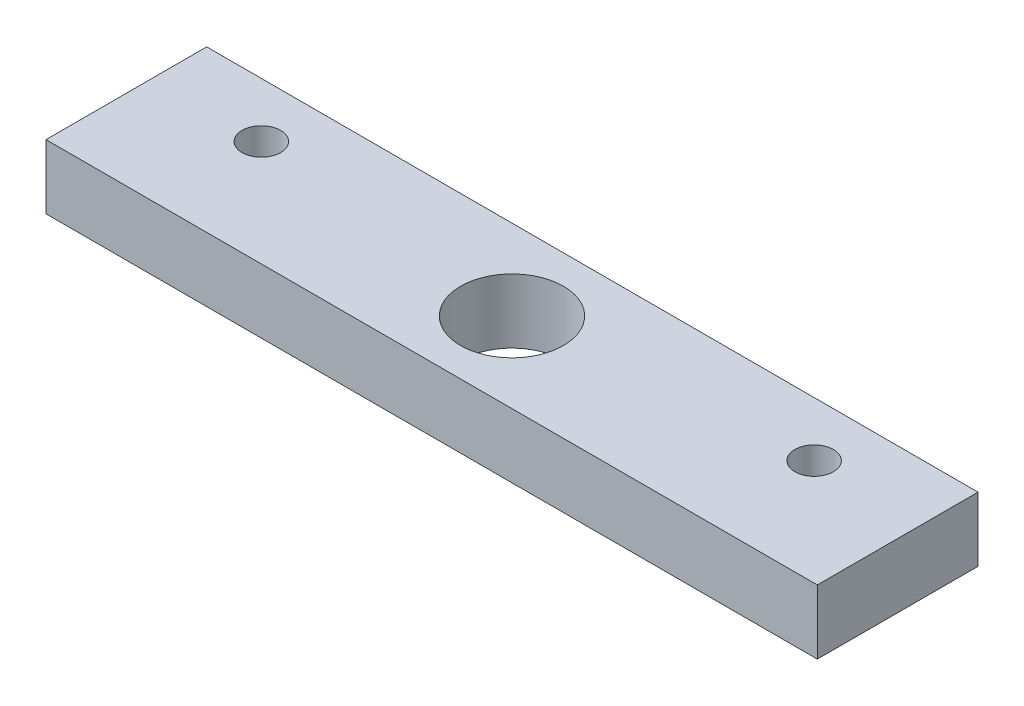
ISO-10303-21;
HEADER;
FILE_DESCRIPTION(('STEP AP214'),'2;1');
FILE_NAME('part.step','',(''),(''),'','','');
FILE_SCHEMA(('AUTOMOTIVE_DESIGN { 1 0 10303 214 1 1 1 1 }'));
ENDSEC;
DATA;
#1=APPLICATION_CONTEXT('core data for automotive mechanical design processes');
#2=APPLICATION_PROTOCOL_DEFINITION('international standard','automotive_design',2000,#1);
#3=PRODUCT_CONTEXT('',#1,'mechanical');
#4=PRODUCT('Part','Part','',(#3));
#5=PRODUCT_RELATED_PRODUCT_CATEGORY('part','',(#4));
#6=PRODUCT_DEFINITION_FORMATION('','',#4);
#7=PRODUCT_DEFINITION_CONTEXT('part definition',#1,'design');
#8=PRODUCT_DEFINITION('design','',#6,#7);
#9=PRODUCT_DEFINITION_SHAPE('','',#8);
#10=(LENGTH_UNIT() NAMED_UNIT(*) SI_UNIT(.MILLI.,.METRE.));
#11=(NAMED_UNIT(*) PLANE_ANGLE_UNIT() SI_UNIT($,.RADIAN.));
#12=(NAMED_UNIT(*) SI_UNIT($,.STERADIAN.) SOLID_ANGLE_UNIT());
#13=UNCERTAINTY_MEASURE_WITH_UNIT(LENGTH_MEASURE(1.E-05),#10,'distance_accuracy_value','');
#14=(GEOMETRIC_REPRESENTATION_CONTEXT(3) GLOBAL_UNCERTAINTY_ASSIGNED_CONTEXT((#13)) GLOBAL_UNIT_ASSIGNED_CONTEXT((#10,
#11,#12)) REPRESENTATION_CONTEXT('',''));
#15=CARTESIAN_POINT('',(0.,0.,0.));
#16=DIRECTION('',(0.,0.,1.));
#17=DIRECTION('',(1.,0.,0.));
#18=AXIS2_PLACEMENT_3D('',#15,#16,#17);
#19=CARTESIAN_POINT('',(0.,0.,0.));
#20=DIRECTION('',(0.,1.,0.));
#21=DIRECTION('',(0.,0.,1.));
#22=AXIS2_PLACEMENT_3D('',#19,#20,#21);
#23=PLANE('',#22);
#24=CARTESIAN_POINT('',(-43.,0.,-3.99999999999999));
#25=DIRECTION('',(0.,-1.,0.));
#26=DIRECTION('',(0.,0.,-1.));
#27=AXIS2_PLACEMENT_3D('',#24,#25,#26);
#28=CIRCLE('',#27,3.);
#29=CARTESIAN_POINT('',(-43.,0.,-6.99999999999999));
#30=VERTEX_POINT('',#29);
#31=EDGE_CURVE('E89',#30,#30,#28,.F.);
#32=ORIENTED_EDGE('',*,*,#31,.T.);
#33=EDGE_LOOP('',(#32));
#34=FACE_BOUND('',#33,.T.);
#35=CARTESIAN_POINT('',(0.,0.,0.));
#36=DIRECTION('',(0.,-1.,0.));
#37=DIRECTION('',(0.,0.,-1.));
#38=AXIS2_PLACEMENT_3D('',#35,#36,#37);
#39=CIRCLE('',#38,8.);
#40=CARTESIAN_POINT('',(0.,0.,-8.));
#41=VERTEX_POINT('',#40);
#42=EDGE_CURVE('E91',#41,#41,#39,.F.);
#43=ORIENTED_EDGE('',*,*,#42,.T.);
#44=EDGE_LOOP('',(#43));
#45=FACE_BOUND('',#44,.T.);
#46=DIRECTION('',(1.,0.,0.));
#47=VECTOR('',#46,1.);
#48=CARTESIAN_POINT('',(60.0000000000001,0.,-12.5));
#49=LINE('',#48,#47);
#50=CARTESIAN_POINT('',(-60.,0.,-12.5));
#51=VERTEX_POINT('',#50);
#52=CARTESIAN_POINT('',(60.0000000000001,0.,-12.5));
#53=VERTEX_POINT('',#52);
#54=EDGE_CURVE('E93',#51,#53,#49,.T.);
#55=ORIENTED_EDGE('',*,*,#54,.T.);
#56=DIRECTION('',(0.,0.,1.));
#57=VECTOR('',#56,1.);
#58=CARTESIAN_POINT('',(60.0000000000001,0.,12.5));
#59=LINE('',#58,#57);
#60=CARTESIAN_POINT('',(60.0000000000001,0.,12.5));
#61=VERTEX_POINT('',#60);
#62=EDGE_CURVE('E71',#53,#61,#59,.T.);
#63=ORIENTED_EDGE('',*,*,#62,.T.);
#64=DIRECTION('',(-1.,0.,0.));
#65=VECTOR('',#64,1.);
#66=CARTESIAN_POINT('',(60.0000000000001,0.,12.5));
#67=LINE('',#66,#65);
#68=CARTESIAN_POINT('',(-60.,0.,12.5));
#69=VERTEX_POINT('',#68);
#70=EDGE_CURVE('E55',#61,#69,#67,.T.);
#71=ORIENTED_EDGE('',*,*,#70,.T.);
#72=DIRECTION('',(0.,0.,-1.));
#73=VECTOR('',#72,1.);
#74=CARTESIAN_POINT('',(-60.,0.,12.5));
#75=LINE('',#74,#73);
#76=EDGE_CURVE('E60',#69,#51,#75,.T.);
#77=ORIENTED_EDGE('',*,*,#76,.T.);
#78=EDGE_LOOP('',(#55,#63,#71,#77));
#79=FACE_BOUND('',#78,.T.);
#80=CARTESIAN_POINT('',(43.,0.,-4.00000000000001));
#81=DIRECTION('',(0.,-1.,0.));
#82=DIRECTION('',(0.,0.,-1.));
#83=AXIS2_PLACEMENT_3D('',#80,#81,#82);
#84=CIRCLE('',#83,2.99999999999999);
#85=CARTESIAN_POINT('',(43.,0.,-7.00000000000001));
#86=VERTEX_POINT('',#85);
#87=EDGE_CURVE('E20',#86,#86,#84,.F.);
#88=ORIENTED_EDGE('',*,*,#87,.T.);
#89=EDGE_LOOP('',(#88));
#90=FACE_BOUND('',#89,.T.);
#91=ADVANCED_FACE('F17',(#34,#45,#79,#90),#23,.F.);
#92=CARTESIAN_POINT('',(43.,10.,-4.00000000000001));
#93=DIRECTION('',(0.,-1.,0.));
#94=DIRECTION('',(0.,0.,-1.));
#95=AXIS2_PLACEMENT_3D('',#92,#93,#94);
#96=CYLINDRICAL_SURFACE('',#95,2.99999999999999);
#97=CARTESIAN_POINT('',(43.,10.,-4.00000000000001));
#98=DIRECTION('',(0.,-1.,0.));
#99=DIRECTION('',(0.,0.,-1.));
#100=AXIS2_PLACEMENT_3D('',#97,#98,#99);
#101=CIRCLE('',#100,2.99999999999999);
#102=CARTESIAN_POINT('',(43.,10.,-7.00000000000001));
#103=VERTEX_POINT('',#102);
#104=EDGE_CURVE('E85',#103,#103,#101,.T.);
#105=ORIENTED_EDGE('',*,*,#104,.F.);
#106=EDGE_LOOP('',(#105));
#107=FACE_BOUND('',#106,.T.);
#108=ORIENTED_EDGE('',*,*,#87,.F.);
#109=EDGE_LOOP('',(#108));
#110=FACE_BOUND('',#109,.T.);
#111=ADVANCED_FACE('F141',(#107,#110),#96,.F.);
#112=CARTESIAN_POINT('',(-60.,10.,12.5));
#113=DIRECTION('',(1.,0.,0.));
#114=DIRECTION('',(0.,0.,-1.));
#115=AXIS2_PLACEMENT_3D('',#112,#113,#114);
#116=PLANE('',#115);
#117=DIRECTION('',(0.,1.,0.));
#118=VECTOR('',#117,1.);
#119=CARTESIAN_POINT('',(-60.,10.,12.5));
#120=LINE('',#119,#118);
#121=CARTESIAN_POINT('',(-60.,10.,12.5));
#122=VERTEX_POINT('',#121);
#123=EDGE_CURVE('E62',#69,#122,#120,.T.);
#124=ORIENTED_EDGE('',*,*,#123,.T.);
#125=DIRECTION('',(0.,0.,1.));
#126=VECTOR('',#125,1.);
#127=CARTESIAN_POINT('',(-60.,10.,0.));
#128=LINE('',#127,#126);
#129=CARTESIAN_POINT('',(-60.,10.,-12.5));
#130=VERTEX_POINT('',#129);
#131=EDGE_CURVE('E88',#130,#122,#128,.T.);
#132=ORIENTED_EDGE('',*,*,#131,.F.);
#133=DIRECTION('',(0.,1.,0.));
#134=VECTOR('',#133,1.);
#135=CARTESIAN_POINT('',(-60.,10.,-12.5));
#136=LINE('',#135,#134);
#137=EDGE_CURVE('E65',#130,#51,#136,.F.);
#138=ORIENTED_EDGE('',*,*,#137,.T.);
#139=ORIENTED_EDGE('',*,*,#76,.F.);
#140=EDGE_LOOP('',(#124,#132,#138,#139));
#141=FACE_BOUND('',#140,.T.);
#142=ADVANCED_FACE('F61',(#141),#116,.F.);
#143=CARTESIAN_POINT('',(60.0000000000001,10.,12.5));
#144=DIRECTION('',(0.,0.,-1.));
#145=DIRECTION('',(-1.,0.,0.));
#146=AXIS2_PLACEMENT_3D('',#143,#144,#145);
#147=PLANE('',#146);
#148=DIRECTION('',(0.,1.,0.));
#149=VECTOR('',#148,1.);
#150=CARTESIAN_POINT('',(60.0000000000001,10.,12.5));
#151=LINE('',#150,#149);
#152=CARTESIAN_POINT('',(60.0000000000001,10.,12.5));
#153=VERTEX_POINT('',#152);
#154=EDGE_CURVE('E73',#61,#153,#151,.T.);
#155=ORIENTED_EDGE('',*,*,#154,.T.);
#156=DIRECTION('',(1.,0.,0.));
#157=VECTOR('',#156,1.);
#158=CARTESIAN_POINT('',(0.,10.,12.5));
#159=LINE('',#158,#157);
#160=EDGE_CURVE('E77',#122,#153,#159,.T.);
#161=ORIENTED_EDGE('',*,*,#160,.F.);
#162=ORIENTED_EDGE('',*,*,#123,.F.);
#163=ORIENTED_EDGE('',*,*,#70,.F.);
#164=EDGE_LOOP('',(#155,#161,#162,#163));
#165=FACE_BOUND('',#164,.T.);
#166=ADVANCED_FACE('F75',(#165),#147,.F.);
#167=CARTESIAN_POINT('',(60.0000000000001,10.,12.5));
#168=DIRECTION('',(-1.,0.,0.));
#169=DIRECTION('',(0.,0.,1.));
#170=AXIS2_PLACEMENT_3D('',#167,#168,#169);
#171=PLANE('',#170);
#172=DIRECTION('',(0.,1.,0.));
#173=VECTOR('',#172,1.);
#174=CARTESIAN_POINT('',(60.0000000000001,10.,-12.5));
#175=LINE('',#174,#173);
#176=CARTESIAN_POINT('',(60.0000000000001,10.,-12.5));
#177=VERTEX_POINT('',#176);
#178=EDGE_CURVE('E35',#53,#177,#175,.T.);
#179=ORIENTED_EDGE('',*,*,#178,.T.);
#180=DIRECTION('',(0.,0.,1.));
#181=VECTOR('',#180,1.);
#182=CARTESIAN_POINT('',(60.0000000000001,10.,0.));
#183=LINE('',#182,#181);
#184=EDGE_CURVE('E103',#153,#177,#183,.F.);
#185=ORIENTED_EDGE('',*,*,#184,.F.);
#186=ORIENTED_EDGE('',*,*,#154,.F.);
#187=ORIENTED_EDGE('',*,*,#62,.F.);
#188=EDGE_LOOP('',(#179,#185,#186,#187));
#189=FACE_BOUND('',#188,.T.);
#190=ADVANCED_FACE('F104',(#189),#171,.F.);
#191=CARTESIAN_POINT('',(60.0000000000001,10.,-12.5));
#192=DIRECTION('',(0.,0.,1.));
#193=DIRECTION('',(1.,0.,0.));
#194=AXIS2_PLACEMENT_3D('',#191,#192,#193);
#195=PLANE('',#194);
#196=ORIENTED_EDGE('',*,*,#137,.F.);
#197=DIRECTION('',(1.,0.,0.));
#198=VECTOR('',#197,1.);
#199=CARTESIAN_POINT('',(0.,10.,-12.5));
#200=LINE('',#199,#198);
#201=EDGE_CURVE('E84',#177,#130,#200,.F.);
#202=ORIENTED_EDGE('',*,*,#201,.F.);
#203=ORIENTED_EDGE('',*,*,#178,.F.);
#204=ORIENTED_EDGE('',*,*,#54,.F.);
#205=EDGE_LOOP('',(#196,#202,#203,#204));
#206=FACE_BOUND('',#205,.T.);
#207=ADVANCED_FACE('F112',(#206),#195,.F.);
#208=CARTESIAN_POINT('',(0.,10.,0.));
#209=DIRECTION('',(0.,-1.,0.));
#210=DIRECTION('',(0.,0.,-1.));
#211=AXIS2_PLACEMENT_3D('',#208,#209,#210);
#212=CYLINDRICAL_SURFACE('',#211,8.);
#213=CARTESIAN_POINT('',(0.,10.,0.));
#214=DIRECTION('',(0.,-1.,0.));
#215=DIRECTION('',(0.,0.,-1.));
#216=AXIS2_PLACEMENT_3D('',#213,#214,#215);
#217=CIRCLE('',#216,8.);
#218=CARTESIAN_POINT('',(0.,10.,-8.));
#219=VERTEX_POINT('',#218);
#220=EDGE_CURVE('E26',#219,#219,#217,.T.);
#221=ORIENTED_EDGE('',*,*,#220,.F.);
#222=EDGE_LOOP('',(#221));
#223=FACE_BOUND('',#222,.T.);
#224=ORIENTED_EDGE('',*,*,#42,.F.);
#225=EDGE_LOOP('',(#224));
#226=FACE_BOUND('',#225,.T.);
#227=ADVANCED_FACE('F114',(#223,#226),#212,.F.);
#228=CARTESIAN_POINT('',(-43.,10.,-3.99999999999999));
#229=DIRECTION('',(0.,-1.,0.));
#230=DIRECTION('',(0.,0.,-1.));
#231=AXIS2_PLACEMENT_3D('',#228,#229,#230);
#232=CYLINDRICAL_SURFACE('',#231,3.);
#233=CARTESIAN_POINT('',(-43.,10.,-3.99999999999999));
#234=DIRECTION('',(0.,-1.,0.));
#235=DIRECTION('',(0.,0.,-1.));
#236=AXIS2_PLACEMENT_3D('',#233,#234,#235);
#237=CIRCLE('',#236,3.);
#238=CARTESIAN_POINT('',(-43.,10.,-6.99999999999999));
#239=VERTEX_POINT('',#238);
#240=EDGE_CURVE('E11',#239,#239,#237,.T.);
#241=ORIENTED_EDGE('',*,*,#240,.F.);
#242=EDGE_LOOP('',(#241));
#243=FACE_BOUND('',#242,.T.);
#244=ORIENTED_EDGE('',*,*,#31,.F.);
#245=EDGE_LOOP('',(#244));
#246=FACE_BOUND('',#245,.T.);
#247=ADVANCED_FACE('F121',(#243,#246),#232,.F.);
#248=CARTESIAN_POINT('',(0.,10.,0.));
#249=DIRECTION('',(0.,1.,0.));
#250=DIRECTION('',(0.,0.,1.));
#251=AXIS2_PLACEMENT_3D('',#248,#249,#250);
#252=PLANE('',#251);
#253=ORIENTED_EDGE('',*,*,#240,.T.);
#254=EDGE_LOOP('',(#253));
#255=FACE_BOUND('',#254,.T.);
#256=ORIENTED_EDGE('',*,*,#220,.T.);
#257=EDGE_LOOP('',(#256));
#258=FACE_BOUND('',#257,.T.);
#259=ORIENTED_EDGE('',*,*,#184,.T.);
#260=ORIENTED_EDGE('',*,*,#201,.T.);
#261=ORIENTED_EDGE('',*,*,#131,.T.);
#262=ORIENTED_EDGE('',*,*,#160,.T.);
#263=EDGE_LOOP('',(#259,#260,#261,#262));
#264=FACE_BOUND('',#263,.T.);
#265=ORIENTED_EDGE('',*,*,#104,.T.);
#266=EDGE_LOOP('',(#265));
#267=FACE_BOUND('',#266,.T.);
#268=ADVANCED_FACE('F108',(#255,#258,#264,#267),#252,.T.);
#269=CLOSED_SHELL('',(#91,#111,#142,#166,#190,#207,#227,#247,#268));
#270=MANIFOLD_SOLID_BREP('B1',#269);
#271=ADVANCED_BREP_SHAPE_REPRESENTATION('',(#18,#270),#14);
#272=SHAPE_DEFINITION_REPRESENTATION(#9,#271);
ENDSEC;
END-ISO-10303-21;
